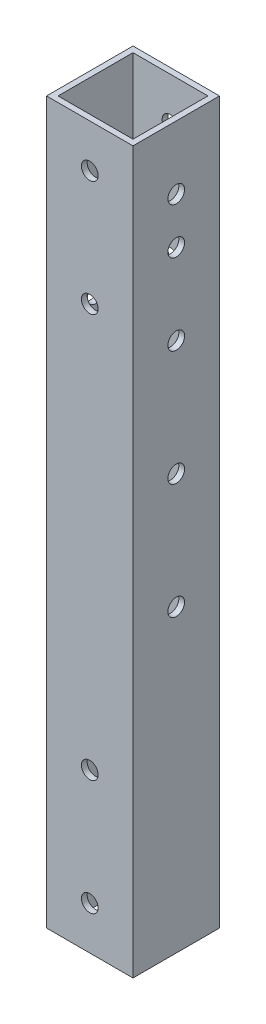
ISO-10303-21;
HEADER;
FILE_DESCRIPTION(('STEP AP214'),'2;1');
FILE_NAME('part.step','',(''),(''),'','','');
FILE_SCHEMA(('AUTOMOTIVE_DESIGN { 1 0 10303 214 1 1 1 1 }'));
ENDSEC;
DATA;
#1=APPLICATION_CONTEXT('core data for automotive mechanical design processes');
#2=APPLICATION_PROTOCOL_DEFINITION('international standard','automotive_design',2000,#1);
#3=PRODUCT_CONTEXT('',#1,'mechanical');
#4=PRODUCT('Part','Part','',(#3));
#5=PRODUCT_RELATED_PRODUCT_CATEGORY('part','',(#4));
#6=PRODUCT_DEFINITION_FORMATION('','',#4);
#7=PRODUCT_DEFINITION_CONTEXT('part definition',#1,'design');
#8=PRODUCT_DEFINITION('design','',#6,#7);
#9=PRODUCT_DEFINITION_SHAPE('','',#8);
#10=(LENGTH_UNIT() NAMED_UNIT(*) SI_UNIT(.MILLI.,.METRE.));
#11=(NAMED_UNIT(*) PLANE_ANGLE_UNIT() SI_UNIT($,.RADIAN.));
#12=(NAMED_UNIT(*) SI_UNIT($,.STERADIAN.) SOLID_ANGLE_UNIT());
#13=UNCERTAINTY_MEASURE_WITH_UNIT(LENGTH_MEASURE(1.E-05),#10,'distance_accuracy_value','');
#14=(GEOMETRIC_REPRESENTATION_CONTEXT(3) GLOBAL_UNCERTAINTY_ASSIGNED_CONTEXT((#13)) GLOBAL_UNIT_ASSIGNED_CONTEXT((#10,
#11,#12)) REPRESENTATION_CONTEXT('',''));
#15=CARTESIAN_POINT('',(0.,0.,0.));
#16=DIRECTION('',(0.,0.,1.));
#17=DIRECTION('',(1.,0.,0.));
#18=AXIS2_PLACEMENT_3D('',#15,#16,#17);
#19=CARTESIAN_POINT('',(0.,125.,0.));
#20=DIRECTION('',(0.,1.,0.));
#21=DIRECTION('',(0.,0.,1.));
#22=AXIS2_PLACEMENT_3D('',#19,#20,#21);
#23=PLANE('',#22);
#24=DIRECTION('',(0.,0.,-1.));
#25=VECTOR('',#24,1.);
#26=CARTESIAN_POINT('',(7.5,125.,7.5));
#27=LINE('',#26,#25);
#28=CARTESIAN_POINT('',(7.5,125.,7.5));
#29=VERTEX_POINT('',#28);
#30=CARTESIAN_POINT('',(7.5,125.,-7.5));
#31=VERTEX_POINT('',#30);
#32=EDGE_CURVE('E187',#29,#31,#27,.T.);
#33=ORIENTED_EDGE('',*,*,#32,.T.);
#34=DIRECTION('',(-1.,0.,0.));
#35=VECTOR('',#34,1.);
#36=CARTESIAN_POINT('',(-7.5,125.,-7.5));
#37=LINE('',#36,#35);
#38=CARTESIAN_POINT('',(-7.5,125.,-7.5));
#39=VERTEX_POINT('',#38);
#40=EDGE_CURVE('E191',#31,#39,#37,.T.);
#41=ORIENTED_EDGE('',*,*,#40,.T.);
#42=DIRECTION('',(0.,0.,1.));
#43=VECTOR('',#42,1.);
#44=CARTESIAN_POINT('',(-7.5,125.,7.5));
#45=LINE('',#44,#43);
#46=CARTESIAN_POINT('',(-7.5,125.,7.5));
#47=VERTEX_POINT('',#46);
#48=EDGE_CURVE('E195',#39,#47,#45,.T.);
#49=ORIENTED_EDGE('',*,*,#48,.T.);
#50=DIRECTION('',(1.,0.,0.));
#51=VECTOR('',#50,1.);
#52=CARTESIAN_POINT('',(-7.5,125.,7.5));
#53=LINE('',#52,#51);
#54=EDGE_CURVE('E198',#47,#29,#53,.T.);
#55=ORIENTED_EDGE('',*,*,#54,.T.);
#56=EDGE_LOOP('',(#33,#41,#49,#55));
#57=FACE_BOUND('',#56,.T.);
#58=DIRECTION('',(-1.,0.,0.));
#59=VECTOR('',#58,1.);
#60=CARTESIAN_POINT('',(0.,125.,-6.5));
#61=LINE('',#60,#59);
#62=CARTESIAN_POINT('',(6.5,125.,-6.5));
#63=VERTEX_POINT('',#62);
#64=CARTESIAN_POINT('',(-6.5,125.,-6.5));
#65=VERTEX_POINT('',#64);
#66=EDGE_CURVE('E146',#63,#65,#61,.T.);
#67=ORIENTED_EDGE('',*,*,#66,.F.);
#68=DIRECTION('',(0.,0.,-1.));
#69=VECTOR('',#68,1.);
#70=CARTESIAN_POINT('',(6.5,125.,0.));
#71=LINE('',#70,#69);
#72=CARTESIAN_POINT('',(6.5,125.,6.5));
#73=VERTEX_POINT('',#72);
#74=EDGE_CURVE('E137',#73,#63,#71,.T.);
#75=ORIENTED_EDGE('',*,*,#74,.F.);
#76=DIRECTION('',(1.,0.,0.));
#77=VECTOR('',#76,1.);
#78=CARTESIAN_POINT('',(0.,125.,6.5));
#79=LINE('',#78,#77);
#80=CARTESIAN_POINT('',(-6.5,125.,6.5));
#81=VERTEX_POINT('',#80);
#82=EDGE_CURVE('E163',#81,#73,#79,.T.);
#83=ORIENTED_EDGE('',*,*,#82,.F.);
#84=DIRECTION('',(0.,0.,1.));
#85=VECTOR('',#84,1.);
#86=CARTESIAN_POINT('',(-6.5,125.,0.));
#87=LINE('',#86,#85);
#88=EDGE_CURVE('E159',#65,#81,#87,.T.);
#89=ORIENTED_EDGE('',*,*,#88,.F.);
#90=EDGE_LOOP('',(#67,#75,#83,#89));
#91=FACE_BOUND('',#90,.T.);
#92=ADVANCED_FACE('F69',(#57,#91),#23,.T.);
#93=CARTESIAN_POINT('',(0.,0.,0.));
#94=DIRECTION('',(0.,1.,0.));
#95=DIRECTION('',(0.,0.,1.));
#96=AXIS2_PLACEMENT_3D('',#93,#94,#95);
#97=PLANE('',#96);
#98=DIRECTION('',(0.,0.,-1.));
#99=VECTOR('',#98,1.);
#100=CARTESIAN_POINT('',(7.5,0.,7.5));
#101=LINE('',#100,#99);
#102=CARTESIAN_POINT('',(7.5,0.,7.5));
#103=VERTEX_POINT('',#102);
#104=CARTESIAN_POINT('',(7.5,0.,-7.5));
#105=VERTEX_POINT('',#104);
#106=EDGE_CURVE('E155',#103,#105,#101,.T.);
#107=ORIENTED_EDGE('',*,*,#106,.F.);
#108=DIRECTION('',(1.,0.,0.));
#109=VECTOR('',#108,1.);
#110=CARTESIAN_POINT('',(-7.5,0.,7.5));
#111=LINE('',#110,#109);
#112=CARTESIAN_POINT('',(-7.5,0.,7.5));
#113=VERTEX_POINT('',#112);
#114=EDGE_CURVE('E192',#113,#103,#111,.T.);
#115=ORIENTED_EDGE('',*,*,#114,.F.);
#116=DIRECTION('',(0.,0.,1.));
#117=VECTOR('',#116,1.);
#118=CARTESIAN_POINT('',(-7.5,0.,7.5));
#119=LINE('',#118,#117);
#120=CARTESIAN_POINT('',(-7.5,0.,-7.5));
#121=VERTEX_POINT('',#120);
#122=EDGE_CURVE('E208',#121,#113,#119,.T.);
#123=ORIENTED_EDGE('',*,*,#122,.F.);
#124=DIRECTION('',(-1.,0.,0.));
#125=VECTOR('',#124,1.);
#126=CARTESIAN_POINT('',(-7.5,0.,-7.5));
#127=LINE('',#126,#125);
#128=EDGE_CURVE('E205',#105,#121,#127,.T.);
#129=ORIENTED_EDGE('',*,*,#128,.F.);
#130=EDGE_LOOP('',(#107,#115,#123,#129));
#131=FACE_BOUND('',#130,.T.);
#132=DIRECTION('',(0.,0.,-1.));
#133=VECTOR('',#132,1.);
#134=CARTESIAN_POINT('',(6.5,0.,0.));
#135=LINE('',#134,#133);
#136=CARTESIAN_POINT('',(6.5,0.,6.5));
#137=VERTEX_POINT('',#136);
#138=CARTESIAN_POINT('',(6.5,0.,-6.5));
#139=VERTEX_POINT('',#138);
#140=EDGE_CURVE('E95',#137,#139,#135,.T.);
#141=ORIENTED_EDGE('',*,*,#140,.T.);
#142=DIRECTION('',(-1.,0.,0.));
#143=VECTOR('',#142,1.);
#144=CARTESIAN_POINT('',(0.,0.,-6.5));
#145=LINE('',#144,#143);
#146=CARTESIAN_POINT('',(-6.5,0.,-6.5));
#147=VERTEX_POINT('',#146);
#148=EDGE_CURVE('E153',#139,#147,#145,.T.);
#149=ORIENTED_EDGE('',*,*,#148,.T.);
#150=DIRECTION('',(0.,0.,1.));
#151=VECTOR('',#150,1.);
#152=CARTESIAN_POINT('',(-6.5,0.,0.));
#153=LINE('',#152,#151);
#154=CARTESIAN_POINT('',(-6.5,0.,6.5));
#155=VERTEX_POINT('',#154);
#156=EDGE_CURVE('E174',#147,#155,#153,.T.);
#157=ORIENTED_EDGE('',*,*,#156,.T.);
#158=DIRECTION('',(1.,0.,0.));
#159=VECTOR('',#158,1.);
#160=CARTESIAN_POINT('',(0.,0.,6.5));
#161=LINE('',#160,#159);
#162=EDGE_CURVE('E147',#155,#137,#161,.T.);
#163=ORIENTED_EDGE('',*,*,#162,.T.);
#164=EDGE_LOOP('',(#141,#149,#157,#163));
#165=FACE_BOUND('',#164,.T.);
#166=ADVANCED_FACE('F358',(#131,#165),#97,.F.);
#167=CARTESIAN_POINT('',(7.5,125.,7.5));
#168=DIRECTION('',(-1.,0.,0.));
#169=DIRECTION('',(0.,0.,1.));
#170=AXIS2_PLACEMENT_3D('',#167,#168,#169);
#171=PLANE('',#170);
#172=CARTESIAN_POINT('',(7.5,106.,0.));
#173=DIRECTION('',(1.,0.,0.));
#174=DIRECTION('',(0.,0.,-1.));
#175=AXIS2_PLACEMENT_3D('',#172,#173,#174);
#176=CIRCLE('',#175,1.45);
#177=CARTESIAN_POINT('',(7.5,106.,-1.45));
#178=VERTEX_POINT('',#177);
#179=EDGE_CURVE('E457',#178,#178,#176,.T.);
#180=ORIENTED_EDGE('',*,*,#179,.F.);
#181=EDGE_LOOP('',(#180));
#182=FACE_BOUND('',#181,.T.);
#183=CARTESIAN_POINT('',(7.5,114.,0.));
#184=DIRECTION('',(1.,0.,0.));
#185=DIRECTION('',(0.,0.,-1.));
#186=AXIS2_PLACEMENT_3D('',#183,#184,#185);
#187=CIRCLE('',#186,1.45);
#188=CARTESIAN_POINT('',(7.5,114.,-1.45));
#189=VERTEX_POINT('',#188);
#190=EDGE_CURVE('E452',#189,#189,#187,.T.);
#191=ORIENTED_EDGE('',*,*,#190,.F.);
#192=EDGE_LOOP('',(#191));
#193=FACE_BOUND('',#192,.T.);
#194=CARTESIAN_POINT('',(7.5,52.,0.));
#195=DIRECTION('',(1.,0.,0.));
#196=DIRECTION('',(0.,0.,-1.));
#197=AXIS2_PLACEMENT_3D('',#194,#195,#196);
#198=CIRCLE('',#197,1.45);
#199=CARTESIAN_POINT('',(7.5,52.,-1.45));
#200=VERTEX_POINT('',#199);
#201=EDGE_CURVE('E444',#200,#200,#198,.T.);
#202=ORIENTED_EDGE('',*,*,#201,.F.);
#203=EDGE_LOOP('',(#202));
#204=FACE_BOUND('',#203,.T.);
#205=CARTESIAN_POINT('',(7.5,92.,0.));
#206=DIRECTION('',(1.,0.,0.));
#207=DIRECTION('',(0.,0.,-1.));
#208=AXIS2_PLACEMENT_3D('',#205,#206,#207);
#209=CIRCLE('',#208,1.45);
#210=CARTESIAN_POINT('',(7.5,92.,-1.45));
#211=VERTEX_POINT('',#210);
#212=EDGE_CURVE('E408',#211,#211,#209,.T.);
#213=ORIENTED_EDGE('',*,*,#212,.F.);
#214=EDGE_LOOP('',(#213));
#215=FACE_BOUND('',#214,.T.);
#216=CARTESIAN_POINT('',(7.5,72.,0.));
#217=DIRECTION('',(1.,0.,0.));
#218=DIRECTION('',(0.,0.,-1.));
#219=AXIS2_PLACEMENT_3D('',#216,#217,#218);
#220=CIRCLE('',#219,1.45);
#221=CARTESIAN_POINT('',(7.5,72.,-1.45));
#222=VERTEX_POINT('',#221);
#223=EDGE_CURVE('E404',#222,#222,#220,.T.);
#224=ORIENTED_EDGE('',*,*,#223,.F.);
#225=EDGE_LOOP('',(#224));
#226=FACE_BOUND('',#225,.T.);
#227=ORIENTED_EDGE('',*,*,#106,.T.);
#228=DIRECTION('',(0.,-1.,0.));
#229=VECTOR('',#228,1.);
#230=CARTESIAN_POINT('',(7.5,125.,-7.5));
#231=LINE('',#230,#229);
#232=EDGE_CURVE('E12',#31,#105,#231,.T.);
#233=ORIENTED_EDGE('',*,*,#232,.F.);
#234=ORIENTED_EDGE('',*,*,#32,.F.);
#235=DIRECTION('',(0.,-1.,0.));
#236=VECTOR('',#235,1.);
#237=CARTESIAN_POINT('',(7.5,125.,7.5));
#238=LINE('',#237,#236);
#239=EDGE_CURVE('E201',#29,#103,#238,.T.);
#240=ORIENTED_EDGE('',*,*,#239,.T.);
#241=EDGE_LOOP('',(#227,#233,#234,#240));
#242=FACE_BOUND('',#241,.T.);
#243=ADVANCED_FACE('F71',(#182,#193,#204,#215,#226,#242),#171,.F.);
#244=CARTESIAN_POINT('',(-7.5,125.,-7.5));
#245=DIRECTION('',(0.,0.,1.));
#246=DIRECTION('',(1.,0.,0.));
#247=AXIS2_PLACEMENT_3D('',#244,#245,#246);
#248=PLANE('',#247);
#249=CARTESIAN_POINT('',(0.,7.5,-7.5));
#250=DIRECTION('',(0.,0.,1.));
#251=DIRECTION('',(1.,0.,0.));
#252=AXIS2_PLACEMENT_3D('',#249,#250,#251);
#253=CIRCLE('',#252,1.45);
#254=CARTESIAN_POINT('',(1.45,7.5,-7.5));
#255=VERTEX_POINT('',#254);
#256=EDGE_CURVE('E228',#255,#255,#253,.T.);
#257=ORIENTED_EDGE('',*,*,#256,.T.);
#258=EDGE_LOOP('',(#257));
#259=FACE_BOUND('',#258,.T.);
#260=CARTESIAN_POINT('',(0.,27.5,-7.5));
#261=DIRECTION('',(0.,0.,1.));
#262=DIRECTION('',(1.,0.,0.));
#263=AXIS2_PLACEMENT_3D('',#260,#261,#262);
#264=CIRCLE('',#263,1.45);
#265=CARTESIAN_POINT('',(1.45,27.5,-7.5));
#266=VERTEX_POINT('',#265);
#267=EDGE_CURVE('E291',#266,#266,#264,.T.);
#268=ORIENTED_EDGE('',*,*,#267,.T.);
#269=EDGE_LOOP('',(#268));
#270=FACE_BOUND('',#269,.T.);
#271=CARTESIAN_POINT('',(0.,97.5,-7.5));
#272=DIRECTION('',(0.,0.,1.));
#273=DIRECTION('',(-1.,0.,0.));
#274=AXIS2_PLACEMENT_3D('',#271,#272,#273);
#275=CIRCLE('',#274,1.45);
#276=CARTESIAN_POINT('',(-1.45,97.5,-7.5));
#277=VERTEX_POINT('',#276);
#278=EDGE_CURVE('E299',#277,#277,#275,.T.);
#279=ORIENTED_EDGE('',*,*,#278,.T.);
#280=EDGE_LOOP('',(#279));
#281=FACE_BOUND('',#280,.T.);
#282=CARTESIAN_POINT('',(0.,117.5,-7.5));
#283=DIRECTION('',(0.,0.,1.));
#284=DIRECTION('',(-1.,0.,0.));
#285=AXIS2_PLACEMENT_3D('',#282,#283,#284);
#286=CIRCLE('',#285,1.45);
#287=CARTESIAN_POINT('',(-1.45,117.5,-7.5));
#288=VERTEX_POINT('',#287);
#289=EDGE_CURVE('E279',#288,#288,#286,.T.);
#290=ORIENTED_EDGE('',*,*,#289,.T.);
#291=EDGE_LOOP('',(#290));
#292=FACE_BOUND('',#291,.T.);
#293=ORIENTED_EDGE('',*,*,#128,.T.);
#294=DIRECTION('',(0.,-1.,0.));
#295=VECTOR('',#294,1.);
#296=CARTESIAN_POINT('',(-7.5,125.,-7.5));
#297=LINE('',#296,#295);
#298=EDGE_CURVE('E79',#39,#121,#297,.T.);
#299=ORIENTED_EDGE('',*,*,#298,.F.);
#300=ORIENTED_EDGE('',*,*,#40,.F.);
#301=ORIENTED_EDGE('',*,*,#232,.T.);
#302=EDGE_LOOP('',(#293,#299,#300,#301));
#303=FACE_BOUND('',#302,.T.);
#304=ADVANCED_FACE('F344',(#259,#270,#281,#292,#303),#248,.F.);
#305=CARTESIAN_POINT('',(-7.5,125.,7.5));
#306=DIRECTION('',(1.,0.,0.));
#307=DIRECTION('',(0.,0.,-1.));
#308=AXIS2_PLACEMENT_3D('',#305,#306,#307);
#309=PLANE('',#308);
#310=CARTESIAN_POINT('',(-7.5,106.,0.));
#311=DIRECTION('',(1.,0.,0.));
#312=DIRECTION('',(0.,0.,-1.));
#313=AXIS2_PLACEMENT_3D('',#310,#311,#312);
#314=CIRCLE('',#313,1.45);
#315=CARTESIAN_POINT('',(-7.5,106.,-1.45));
#316=VERTEX_POINT('',#315);
#317=EDGE_CURVE('E387',#316,#316,#314,.T.);
#318=ORIENTED_EDGE('',*,*,#317,.T.);
#319=EDGE_LOOP('',(#318));
#320=FACE_BOUND('',#319,.T.);
#321=CARTESIAN_POINT('',(-7.5,114.,0.));
#322=DIRECTION('',(1.,0.,0.));
#323=DIRECTION('',(0.,0.,-1.));
#324=AXIS2_PLACEMENT_3D('',#321,#322,#323);
#325=CIRCLE('',#324,1.45);
#326=CARTESIAN_POINT('',(-7.5,114.,-1.45));
#327=VERTEX_POINT('',#326);
#328=EDGE_CURVE('E391',#327,#327,#325,.T.);
#329=ORIENTED_EDGE('',*,*,#328,.T.);
#330=EDGE_LOOP('',(#329));
#331=FACE_BOUND('',#330,.T.);
#332=CARTESIAN_POINT('',(-7.5,52.,0.));
#333=DIRECTION('',(1.,0.,0.));
#334=DIRECTION('',(0.,0.,-1.));
#335=AXIS2_PLACEMENT_3D('',#332,#333,#334);
#336=CIRCLE('',#335,1.45);
#337=CARTESIAN_POINT('',(-7.5,52.,-1.45));
#338=VERTEX_POINT('',#337);
#339=EDGE_CURVE('E395',#338,#338,#336,.T.);
#340=ORIENTED_EDGE('',*,*,#339,.T.);
#341=EDGE_LOOP('',(#340));
#342=FACE_BOUND('',#341,.T.);
#343=CARTESIAN_POINT('',(-7.5,92.,0.));
#344=DIRECTION('',(1.,0.,0.));
#345=DIRECTION('',(0.,0.,-1.));
#346=AXIS2_PLACEMENT_3D('',#343,#344,#345);
#347=CIRCLE('',#346,1.45);
#348=CARTESIAN_POINT('',(-7.5,92.,-1.45));
#349=VERTEX_POINT('',#348);
#350=EDGE_CURVE('E399',#349,#349,#347,.T.);
#351=ORIENTED_EDGE('',*,*,#350,.T.);
#352=EDGE_LOOP('',(#351));
#353=FACE_BOUND('',#352,.T.);
#354=CARTESIAN_POINT('',(-7.5,72.,0.));
#355=DIRECTION('',(1.,0.,0.));
#356=DIRECTION('',(0.,0.,-1.));
#357=AXIS2_PLACEMENT_3D('',#354,#355,#356);
#358=CIRCLE('',#357,1.45);
#359=CARTESIAN_POINT('',(-7.5,72.,-1.45));
#360=VERTEX_POINT('',#359);
#361=EDGE_CURVE('E248',#360,#360,#358,.T.);
#362=ORIENTED_EDGE('',*,*,#361,.T.);
#363=EDGE_LOOP('',(#362));
#364=FACE_BOUND('',#363,.T.);
#365=ORIENTED_EDGE('',*,*,#122,.T.);
#366=DIRECTION('',(0.,-1.,0.));
#367=VECTOR('',#366,1.);
#368=CARTESIAN_POINT('',(-7.5,125.,7.5));
#369=LINE('',#368,#367);
#370=EDGE_CURVE('E216',#47,#113,#369,.T.);
#371=ORIENTED_EDGE('',*,*,#370,.F.);
#372=ORIENTED_EDGE('',*,*,#48,.F.);
#373=ORIENTED_EDGE('',*,*,#298,.T.);
#374=EDGE_LOOP('',(#365,#371,#372,#373));
#375=FACE_BOUND('',#374,.T.);
#376=ADVANCED_FACE('F347',(#320,#331,#342,#353,#364,#375),#309,.F.);
#377=CARTESIAN_POINT('',(-7.5,125.,7.5));
#378=DIRECTION('',(0.,0.,-1.));
#379=DIRECTION('',(-1.,0.,0.));
#380=AXIS2_PLACEMENT_3D('',#377,#378,#379);
#381=PLANE('',#380);
#382=CARTESIAN_POINT('',(0.,7.5,7.5));
#383=DIRECTION('',(0.,0.,1.));
#384=DIRECTION('',(1.,0.,0.));
#385=AXIS2_PLACEMENT_3D('',#382,#383,#384);
#386=CIRCLE('',#385,1.45);
#387=CARTESIAN_POINT('',(1.45,7.5,7.5));
#388=VERTEX_POINT('',#387);
#389=EDGE_CURVE('E283',#388,#388,#386,.T.);
#390=ORIENTED_EDGE('',*,*,#389,.F.);
#391=EDGE_LOOP('',(#390));
#392=FACE_BOUND('',#391,.T.);
#393=CARTESIAN_POINT('',(0.,27.5,7.5));
#394=DIRECTION('',(0.,0.,1.));
#395=DIRECTION('',(1.,0.,0.));
#396=AXIS2_PLACEMENT_3D('',#393,#394,#395);
#397=CIRCLE('',#396,1.45);
#398=CARTESIAN_POINT('',(1.45,27.5,7.5));
#399=VERTEX_POINT('',#398);
#400=EDGE_CURVE('E287',#399,#399,#397,.T.);
#401=ORIENTED_EDGE('',*,*,#400,.F.);
#402=EDGE_LOOP('',(#401));
#403=FACE_BOUND('',#402,.T.);
#404=CARTESIAN_POINT('',(0.,97.5,7.5));
#405=DIRECTION('',(0.,0.,1.));
#406=DIRECTION('',(-1.,0.,0.));
#407=AXIS2_PLACEMENT_3D('',#404,#405,#406);
#408=CIRCLE('',#407,1.45);
#409=CARTESIAN_POINT('',(-1.45,97.5,7.5));
#410=VERTEX_POINT('',#409);
#411=EDGE_CURVE('E295',#410,#410,#408,.T.);
#412=ORIENTED_EDGE('',*,*,#411,.F.);
#413=EDGE_LOOP('',(#412));
#414=FACE_BOUND('',#413,.T.);
#415=CARTESIAN_POINT('',(0.,117.5,7.5));
#416=DIRECTION('',(0.,0.,1.));
#417=DIRECTION('',(-1.,0.,0.));
#418=AXIS2_PLACEMENT_3D('',#415,#416,#417);
#419=CIRCLE('',#418,1.45);
#420=CARTESIAN_POINT('',(-1.45,117.5,7.5));
#421=VERTEX_POINT('',#420);
#422=EDGE_CURVE('E303',#421,#421,#419,.T.);
#423=ORIENTED_EDGE('',*,*,#422,.F.);
#424=EDGE_LOOP('',(#423));
#425=FACE_BOUND('',#424,.T.);
#426=ORIENTED_EDGE('',*,*,#114,.T.);
#427=ORIENTED_EDGE('',*,*,#239,.F.);
#428=ORIENTED_EDGE('',*,*,#54,.F.);
#429=ORIENTED_EDGE('',*,*,#370,.T.);
#430=EDGE_LOOP('',(#426,#427,#428,#429));
#431=FACE_BOUND('',#430,.T.);
#432=ADVANCED_FACE('F362',(#392,#403,#414,#425,#431),#381,.F.);
#433=CARTESIAN_POINT('',(6.5,125.,0.));
#434=DIRECTION('',(-1.,0.,0.));
#435=DIRECTION('',(0.,0.,1.));
#436=AXIS2_PLACEMENT_3D('',#433,#434,#435);
#437=PLANE('',#436);
#438=CARTESIAN_POINT('',(6.5,106.,0.));
#439=DIRECTION('',(-1.,0.,0.));
#440=DIRECTION('',(0.,0.,1.));
#441=AXIS2_PLACEMENT_3D('',#438,#439,#440);
#442=CIRCLE('',#441,1.45);
#443=CARTESIAN_POINT('',(6.5,106.,1.45));
#444=VERTEX_POINT('',#443);
#445=EDGE_CURVE('E275',#444,#444,#442,.T.);
#446=ORIENTED_EDGE('',*,*,#445,.F.);
#447=EDGE_LOOP('',(#446));
#448=FACE_BOUND('',#447,.T.);
#449=CARTESIAN_POINT('',(6.5,114.,0.));
#450=DIRECTION('',(-1.,0.,0.));
#451=DIRECTION('',(0.,0.,1.));
#452=AXIS2_PLACEMENT_3D('',#449,#450,#451);
#453=CIRCLE('',#452,1.45);
#454=CARTESIAN_POINT('',(6.5,114.,1.45));
#455=VERTEX_POINT('',#454);
#456=EDGE_CURVE('E261',#455,#455,#453,.T.);
#457=ORIENTED_EDGE('',*,*,#456,.F.);
#458=EDGE_LOOP('',(#457));
#459=FACE_BOUND('',#458,.T.);
#460=CARTESIAN_POINT('',(6.5,52.,0.));
#461=DIRECTION('',(-1.,0.,0.));
#462=DIRECTION('',(0.,0.,1.));
#463=AXIS2_PLACEMENT_3D('',#460,#461,#462);
#464=CIRCLE('',#463,1.45);
#465=CARTESIAN_POINT('',(6.5,52.,1.45));
#466=VERTEX_POINT('',#465);
#467=EDGE_CURVE('E257',#466,#466,#464,.T.);
#468=ORIENTED_EDGE('',*,*,#467,.F.);
#469=EDGE_LOOP('',(#468));
#470=FACE_BOUND('',#469,.T.);
#471=CARTESIAN_POINT('',(6.5,92.,0.));
#472=DIRECTION('',(-1.,0.,0.));
#473=DIRECTION('',(0.,0.,1.));
#474=AXIS2_PLACEMENT_3D('',#471,#472,#473);
#475=CIRCLE('',#474,1.45);
#476=CARTESIAN_POINT('',(6.5,92.,1.45));
#477=VERTEX_POINT('',#476);
#478=EDGE_CURVE('E253',#477,#477,#475,.T.);
#479=ORIENTED_EDGE('',*,*,#478,.F.);
#480=EDGE_LOOP('',(#479));
#481=FACE_BOUND('',#480,.T.);
#482=CARTESIAN_POINT('',(6.5,72.,0.));
#483=DIRECTION('',(-1.,0.,0.));
#484=DIRECTION('',(0.,0.,1.));
#485=AXIS2_PLACEMENT_3D('',#482,#483,#484);
#486=CIRCLE('',#485,1.45);
#487=CARTESIAN_POINT('',(6.5,72.,1.45));
#488=VERTEX_POINT('',#487);
#489=EDGE_CURVE('E247',#488,#488,#486,.T.);
#490=ORIENTED_EDGE('',*,*,#489,.F.);
#491=EDGE_LOOP('',(#490));
#492=FACE_BOUND('',#491,.T.);
#493=ORIENTED_EDGE('',*,*,#140,.F.);
#494=DIRECTION('',(0.,-1.,0.));
#495=VECTOR('',#494,1.);
#496=CARTESIAN_POINT('',(6.5,125.,6.5));
#497=LINE('',#496,#495);
#498=EDGE_CURVE('E141',#73,#137,#497,.T.);
#499=ORIENTED_EDGE('',*,*,#498,.F.);
#500=ORIENTED_EDGE('',*,*,#74,.T.);
#501=DIRECTION('',(0.,-1.,0.));
#502=VECTOR('',#501,1.);
#503=CARTESIAN_POINT('',(6.5,125.,-6.5));
#504=LINE('',#503,#502);
#505=EDGE_CURVE('E140',#63,#139,#504,.T.);
#506=ORIENTED_EDGE('',*,*,#505,.T.);
#507=EDGE_LOOP('',(#493,#499,#500,#506));
#508=FACE_BOUND('',#507,.T.);
#509=ADVANCED_FACE('F139',(#448,#459,#470,#481,#492,#508),#437,.T.);
#510=CARTESIAN_POINT('',(0.,125.,-6.5));
#511=DIRECTION('',(0.,0.,1.));
#512=DIRECTION('',(1.,0.,0.));
#513=AXIS2_PLACEMENT_3D('',#510,#511,#512);
#514=PLANE('',#513);
#515=CARTESIAN_POINT('',(0.,7.5,-6.5));
#516=DIRECTION('',(0.,0.,1.));
#517=DIRECTION('',(1.,0.,0.));
#518=AXIS2_PLACEMENT_3D('',#515,#516,#517);
#519=CIRCLE('',#518,1.45);
#520=CARTESIAN_POINT('',(1.45,7.5,-6.5));
#521=VERTEX_POINT('',#520);
#522=EDGE_CURVE('E171',#521,#521,#519,.T.);
#523=ORIENTED_EDGE('',*,*,#522,.F.);
#524=EDGE_LOOP('',(#523));
#525=FACE_BOUND('',#524,.T.);
#526=CARTESIAN_POINT('',(0.,27.5,-6.5));
#527=DIRECTION('',(0.,0.,1.));
#528=DIRECTION('',(1.,0.,0.));
#529=AXIS2_PLACEMENT_3D('',#526,#527,#528);
#530=CIRCLE('',#529,1.45);
#531=CARTESIAN_POINT('',(1.45,27.5,-6.5));
#532=VERTEX_POINT('',#531);
#533=EDGE_CURVE('E238',#532,#532,#530,.T.);
#534=ORIENTED_EDGE('',*,*,#533,.F.);
#535=EDGE_LOOP('',(#534));
#536=FACE_BOUND('',#535,.T.);
#537=CARTESIAN_POINT('',(0.,97.5,-6.5));
#538=DIRECTION('',(0.,0.,1.));
#539=DIRECTION('',(1.,0.,0.));
#540=AXIS2_PLACEMENT_3D('',#537,#538,#539);
#541=CIRCLE('',#540,1.45);
#542=CARTESIAN_POINT('',(1.45,97.5,-6.5));
#543=VERTEX_POINT('',#542);
#544=EDGE_CURVE('E233',#543,#543,#541,.T.);
#545=ORIENTED_EDGE('',*,*,#544,.F.);
#546=EDGE_LOOP('',(#545));
#547=FACE_BOUND('',#546,.T.);
#548=CARTESIAN_POINT('',(0.,117.5,-6.5));
#549=DIRECTION('',(0.,0.,1.));
#550=DIRECTION('',(1.,0.,0.));
#551=AXIS2_PLACEMENT_3D('',#548,#549,#550);
#552=CIRCLE('',#551,1.45);
#553=CARTESIAN_POINT('',(1.45,117.5,-6.5));
#554=VERTEX_POINT('',#553);
#555=EDGE_CURVE('E227',#554,#554,#552,.T.);
#556=ORIENTED_EDGE('',*,*,#555,.F.);
#557=EDGE_LOOP('',(#556));
#558=FACE_BOUND('',#557,.T.);
#559=ORIENTED_EDGE('',*,*,#148,.F.);
#560=ORIENTED_EDGE('',*,*,#505,.F.);
#561=ORIENTED_EDGE('',*,*,#66,.T.);
#562=DIRECTION('',(0.,-1.,0.));
#563=VECTOR('',#562,1.);
#564=CARTESIAN_POINT('',(-6.5,125.,-6.5));
#565=LINE('',#564,#563);
#566=EDGE_CURVE('E156',#65,#147,#565,.T.);
#567=ORIENTED_EDGE('',*,*,#566,.T.);
#568=EDGE_LOOP('',(#559,#560,#561,#567));
#569=FACE_BOUND('',#568,.T.);
#570=ADVANCED_FACE('F150',(#525,#536,#547,#558,#569),#514,.T.);
#571=CARTESIAN_POINT('',(-6.5,125.,0.));
#572=DIRECTION('',(1.,0.,0.));
#573=DIRECTION('',(0.,0.,-1.));
#574=AXIS2_PLACEMENT_3D('',#571,#572,#573);
#575=PLANE('',#574);
#576=CARTESIAN_POINT('',(-6.5,106.,0.));
#577=DIRECTION('',(1.,0.,0.));
#578=DIRECTION('',(0.,0.,-1.));
#579=AXIS2_PLACEMENT_3D('',#576,#577,#578);
#580=CIRCLE('',#579,1.45);
#581=CARTESIAN_POINT('',(-6.5,106.,-1.45));
#582=VERTEX_POINT('',#581);
#583=EDGE_CURVE('E73',#582,#582,#580,.T.);
#584=ORIENTED_EDGE('',*,*,#583,.F.);
#585=EDGE_LOOP('',(#584));
#586=FACE_BOUND('',#585,.T.);
#587=CARTESIAN_POINT('',(-6.5,114.,0.));
#588=DIRECTION('',(1.,0.,0.));
#589=DIRECTION('',(0.,0.,-1.));
#590=AXIS2_PLACEMENT_3D('',#587,#588,#589);
#591=CIRCLE('',#590,1.45);
#592=CARTESIAN_POINT('',(-6.5,114.,-1.45));
#593=VERTEX_POINT('',#592);
#594=EDGE_CURVE('E258',#593,#593,#591,.T.);
#595=ORIENTED_EDGE('',*,*,#594,.F.);
#596=EDGE_LOOP('',(#595));
#597=FACE_BOUND('',#596,.T.);
#598=CARTESIAN_POINT('',(-6.5,52.,0.));
#599=DIRECTION('',(1.,0.,0.));
#600=DIRECTION('',(0.,0.,-1.));
#601=AXIS2_PLACEMENT_3D('',#598,#599,#600);
#602=CIRCLE('',#601,1.45);
#603=CARTESIAN_POINT('',(-6.5,52.,-1.45));
#604=VERTEX_POINT('',#603);
#605=EDGE_CURVE('E254',#604,#604,#602,.T.);
#606=ORIENTED_EDGE('',*,*,#605,.F.);
#607=EDGE_LOOP('',(#606));
#608=FACE_BOUND('',#607,.T.);
#609=CARTESIAN_POINT('',(-6.5,92.,0.));
#610=DIRECTION('',(1.,0.,0.));
#611=DIRECTION('',(0.,0.,-1.));
#612=AXIS2_PLACEMENT_3D('',#609,#610,#611);
#613=CIRCLE('',#612,1.45);
#614=CARTESIAN_POINT('',(-6.5,92.,-1.45));
#615=VERTEX_POINT('',#614);
#616=EDGE_CURVE('E249',#615,#615,#613,.T.);
#617=ORIENTED_EDGE('',*,*,#616,.F.);
#618=EDGE_LOOP('',(#617));
#619=FACE_BOUND('',#618,.T.);
#620=CARTESIAN_POINT('',(-6.5,72.,0.));
#621=DIRECTION('',(1.,0.,0.));
#622=DIRECTION('',(0.,0.,-1.));
#623=AXIS2_PLACEMENT_3D('',#620,#621,#622);
#624=CIRCLE('',#623,1.45);
#625=CARTESIAN_POINT('',(-6.5,72.,-1.45));
#626=VERTEX_POINT('',#625);
#627=EDGE_CURVE('E243',#626,#626,#624,.T.);
#628=ORIENTED_EDGE('',*,*,#627,.F.);
#629=EDGE_LOOP('',(#628));
#630=FACE_BOUND('',#629,.T.);
#631=ORIENTED_EDGE('',*,*,#156,.F.);
#632=ORIENTED_EDGE('',*,*,#566,.F.);
#633=ORIENTED_EDGE('',*,*,#88,.T.);
#634=DIRECTION('',(0.,-1.,0.));
#635=VECTOR('',#634,1.);
#636=CARTESIAN_POINT('',(-6.5,125.,6.5));
#637=LINE('',#636,#635);
#638=EDGE_CURVE('E87',#81,#155,#637,.T.);
#639=ORIENTED_EDGE('',*,*,#638,.T.);
#640=EDGE_LOOP('',(#631,#632,#633,#639));
#641=FACE_BOUND('',#640,.T.);
#642=ADVANCED_FACE('F327',(#586,#597,#608,#619,#630,#641),#575,.T.);
#643=CARTESIAN_POINT('',(0.,125.,6.5));
#644=DIRECTION('',(0.,0.,-1.));
#645=DIRECTION('',(-1.,0.,0.));
#646=AXIS2_PLACEMENT_3D('',#643,#644,#645);
#647=PLANE('',#646);
#648=CARTESIAN_POINT('',(0.,7.5,6.5));
#649=DIRECTION('',(0.,0.,-1.));
#650=DIRECTION('',(-1.,0.,0.));
#651=AXIS2_PLACEMENT_3D('',#648,#649,#650);
#652=CIRCLE('',#651,1.45);
#653=CARTESIAN_POINT('',(-1.45,7.5,6.5));
#654=VERTEX_POINT('',#653);
#655=EDGE_CURVE('E239',#654,#654,#652,.T.);
#656=ORIENTED_EDGE('',*,*,#655,.F.);
#657=EDGE_LOOP('',(#656));
#658=FACE_BOUND('',#657,.T.);
#659=CARTESIAN_POINT('',(0.,27.5,6.5));
#660=DIRECTION('',(0.,0.,-1.));
#661=DIRECTION('',(-1.,0.,0.));
#662=AXIS2_PLACEMENT_3D('',#659,#660,#661);
#663=CIRCLE('',#662,1.45);
#664=CARTESIAN_POINT('',(-1.45,27.5,6.5));
#665=VERTEX_POINT('',#664);
#666=EDGE_CURVE('E234',#665,#665,#663,.T.);
#667=ORIENTED_EDGE('',*,*,#666,.F.);
#668=EDGE_LOOP('',(#667));
#669=FACE_BOUND('',#668,.T.);
#670=CARTESIAN_POINT('',(0.,97.5,6.5));
#671=DIRECTION('',(0.,0.,-1.));
#672=DIRECTION('',(-1.,0.,0.));
#673=AXIS2_PLACEMENT_3D('',#670,#671,#672);
#674=CIRCLE('',#673,1.45);
#675=CARTESIAN_POINT('',(-1.45,97.5,6.5));
#676=VERTEX_POINT('',#675);
#677=EDGE_CURVE('E229',#676,#676,#674,.T.);
#678=ORIENTED_EDGE('',*,*,#677,.F.);
#679=EDGE_LOOP('',(#678));
#680=FACE_BOUND('',#679,.T.);
#681=CARTESIAN_POINT('',(0.,117.5,6.5));
#682=DIRECTION('',(0.,0.,-1.));
#683=DIRECTION('',(-1.,0.,0.));
#684=AXIS2_PLACEMENT_3D('',#681,#682,#683);
#685=CIRCLE('',#684,1.45);
#686=CARTESIAN_POINT('',(-1.45,117.5,6.5));
#687=VERTEX_POINT('',#686);
#688=EDGE_CURVE('E223',#687,#687,#685,.T.);
#689=ORIENTED_EDGE('',*,*,#688,.F.);
#690=EDGE_LOOP('',(#689));
#691=FACE_BOUND('',#690,.T.);
#692=ORIENTED_EDGE('',*,*,#162,.F.);
#693=ORIENTED_EDGE('',*,*,#638,.F.);
#694=ORIENTED_EDGE('',*,*,#82,.T.);
#695=ORIENTED_EDGE('',*,*,#498,.T.);
#696=EDGE_LOOP('',(#692,#693,#694,#695));
#697=FACE_BOUND('',#696,.T.);
#698=ADVANCED_FACE('F494',(#658,#669,#680,#691,#697),#647,.T.);
#699=CARTESIAN_POINT('',(0.,117.5,-7.5));
#700=DIRECTION('',(0.,0.,1.));
#701=DIRECTION('',(1.,0.,0.));
#702=AXIS2_PLACEMENT_3D('',#699,#700,#701);
#703=CYLINDRICAL_SURFACE('',#702,1.45);
#704=ORIENTED_EDGE('',*,*,#688,.T.);
#705=EDGE_LOOP('',(#704));
#706=FACE_BOUND('',#705,.T.);
#707=ORIENTED_EDGE('',*,*,#422,.T.);
#708=EDGE_LOOP('',(#707));
#709=FACE_BOUND('',#708,.T.);
#710=ADVANCED_FACE('F341',(#706,#709),#703,.F.);
#711=CARTESIAN_POINT('',(0.,97.5,-7.5));
#712=DIRECTION('',(0.,0.,1.));
#713=DIRECTION('',(1.,0.,0.));
#714=AXIS2_PLACEMENT_3D('',#711,#712,#713);
#715=CYLINDRICAL_SURFACE('',#714,1.45);
#716=ORIENTED_EDGE('',*,*,#677,.T.);
#717=EDGE_LOOP('',(#716));
#718=FACE_BOUND('',#717,.T.);
#719=ORIENTED_EDGE('',*,*,#411,.T.);
#720=EDGE_LOOP('',(#719));
#721=FACE_BOUND('',#720,.T.);
#722=ADVANCED_FACE('F504',(#718,#721),#715,.F.);
#723=CARTESIAN_POINT('',(0.,27.5,-7.5));
#724=DIRECTION('',(0.,0.,1.));
#725=DIRECTION('',(1.,0.,0.));
#726=AXIS2_PLACEMENT_3D('',#723,#724,#725);
#727=CYLINDRICAL_SURFACE('',#726,1.45);
#728=ORIENTED_EDGE('',*,*,#666,.T.);
#729=EDGE_LOOP('',(#728));
#730=FACE_BOUND('',#729,.T.);
#731=ORIENTED_EDGE('',*,*,#400,.T.);
#732=EDGE_LOOP('',(#731));
#733=FACE_BOUND('',#732,.T.);
#734=ADVANCED_FACE('F511',(#730,#733),#727,.F.);
#735=CARTESIAN_POINT('',(0.,7.5,-7.5));
#736=DIRECTION('',(0.,0.,1.));
#737=DIRECTION('',(1.,0.,0.));
#738=AXIS2_PLACEMENT_3D('',#735,#736,#737);
#739=CYLINDRICAL_SURFACE('',#738,1.45);
#740=ORIENTED_EDGE('',*,*,#655,.T.);
#741=EDGE_LOOP('',(#740));
#742=FACE_BOUND('',#741,.T.);
#743=ORIENTED_EDGE('',*,*,#389,.T.);
#744=EDGE_LOOP('',(#743));
#745=FACE_BOUND('',#744,.T.);
#746=ADVANCED_FACE('F339',(#742,#745),#739,.F.);
#747=ORIENTED_EDGE('',*,*,#555,.T.);
#748=EDGE_LOOP('',(#747));
#749=FACE_BOUND('',#748,.T.);
#750=ORIENTED_EDGE('',*,*,#289,.F.);
#751=EDGE_LOOP('',(#750));
#752=FACE_BOUND('',#751,.T.);
#753=ADVANCED_FACE('F335',(#749,#752),#703,.F.);
#754=ORIENTED_EDGE('',*,*,#544,.T.);
#755=EDGE_LOOP('',(#754));
#756=FACE_BOUND('',#755,.T.);
#757=ORIENTED_EDGE('',*,*,#278,.F.);
#758=EDGE_LOOP('',(#757));
#759=FACE_BOUND('',#758,.T.);
#760=ADVANCED_FACE('F338',(#756,#759),#715,.F.);
#761=ORIENTED_EDGE('',*,*,#533,.T.);
#762=EDGE_LOOP('',(#761));
#763=FACE_BOUND('',#762,.T.);
#764=ORIENTED_EDGE('',*,*,#267,.F.);
#765=EDGE_LOOP('',(#764));
#766=FACE_BOUND('',#765,.T.);
#767=ADVANCED_FACE('F490',(#763,#766),#727,.F.);
#768=ORIENTED_EDGE('',*,*,#522,.T.);
#769=EDGE_LOOP('',(#768));
#770=FACE_BOUND('',#769,.T.);
#771=ORIENTED_EDGE('',*,*,#256,.F.);
#772=EDGE_LOOP('',(#771));
#773=FACE_BOUND('',#772,.T.);
#774=ADVANCED_FACE('F322',(#770,#773),#739,.F.);
#775=CARTESIAN_POINT('',(-7.5,72.,0.));
#776=DIRECTION('',(1.,0.,0.));
#777=DIRECTION('',(0.,0.,-1.));
#778=AXIS2_PLACEMENT_3D('',#775,#776,#777);
#779=CYLINDRICAL_SURFACE('',#778,1.45);
#780=ORIENTED_EDGE('',*,*,#627,.T.);
#781=EDGE_LOOP('',(#780));
#782=FACE_BOUND('',#781,.T.);
#783=ORIENTED_EDGE('',*,*,#361,.F.);
#784=EDGE_LOOP('',(#783));
#785=FACE_BOUND('',#784,.T.);
#786=ADVANCED_FACE('F474',(#782,#785),#779,.F.);
#787=CARTESIAN_POINT('',(-7.5,92.,0.));
#788=DIRECTION('',(1.,0.,0.));
#789=DIRECTION('',(0.,0.,-1.));
#790=AXIS2_PLACEMENT_3D('',#787,#788,#789);
#791=CYLINDRICAL_SURFACE('',#790,1.45);
#792=ORIENTED_EDGE('',*,*,#616,.T.);
#793=EDGE_LOOP('',(#792));
#794=FACE_BOUND('',#793,.T.);
#795=ORIENTED_EDGE('',*,*,#350,.F.);
#796=EDGE_LOOP('',(#795));
#797=FACE_BOUND('',#796,.T.);
#798=ADVANCED_FACE('F437',(#794,#797),#791,.F.);
#799=CARTESIAN_POINT('',(-7.5,52.,0.));
#800=DIRECTION('',(1.,0.,0.));
#801=DIRECTION('',(0.,0.,-1.));
#802=AXIS2_PLACEMENT_3D('',#799,#800,#801);
#803=CYLINDRICAL_SURFACE('',#802,1.45);
#804=ORIENTED_EDGE('',*,*,#605,.T.);
#805=EDGE_LOOP('',(#804));
#806=FACE_BOUND('',#805,.T.);
#807=ORIENTED_EDGE('',*,*,#339,.F.);
#808=EDGE_LOOP('',(#807));
#809=FACE_BOUND('',#808,.T.);
#810=ADVANCED_FACE('F487',(#806,#809),#803,.F.);
#811=CARTESIAN_POINT('',(-7.5,114.,0.));
#812=DIRECTION('',(1.,0.,0.));
#813=DIRECTION('',(0.,0.,-1.));
#814=AXIS2_PLACEMENT_3D('',#811,#812,#813);
#815=CYLINDRICAL_SURFACE('',#814,1.45);
#816=ORIENTED_EDGE('',*,*,#594,.T.);
#817=EDGE_LOOP('',(#816));
#818=FACE_BOUND('',#817,.T.);
#819=ORIENTED_EDGE('',*,*,#328,.F.);
#820=EDGE_LOOP('',(#819));
#821=FACE_BOUND('',#820,.T.);
#822=ADVANCED_FACE('F478',(#818,#821),#815,.F.);
#823=CARTESIAN_POINT('',(-7.5,106.,0.));
#824=DIRECTION('',(1.,0.,0.));
#825=DIRECTION('',(0.,0.,-1.));
#826=AXIS2_PLACEMENT_3D('',#823,#824,#825);
#827=CYLINDRICAL_SURFACE('',#826,1.45);
#828=ORIENTED_EDGE('',*,*,#583,.T.);
#829=EDGE_LOOP('',(#828));
#830=FACE_BOUND('',#829,.T.);
#831=ORIENTED_EDGE('',*,*,#317,.F.);
#832=EDGE_LOOP('',(#831));
#833=FACE_BOUND('',#832,.T.);
#834=ADVANCED_FACE('F472',(#830,#833),#827,.F.);
#835=ORIENTED_EDGE('',*,*,#489,.T.);
#836=EDGE_LOOP('',(#835));
#837=FACE_BOUND('',#836,.T.);
#838=ORIENTED_EDGE('',*,*,#223,.T.);
#839=EDGE_LOOP('',(#838));
#840=FACE_BOUND('',#839,.T.);
#841=ADVANCED_FACE('F416',(#837,#840),#779,.F.);
#842=ORIENTED_EDGE('',*,*,#478,.T.);
#843=EDGE_LOOP('',(#842));
#844=FACE_BOUND('',#843,.T.);
#845=ORIENTED_EDGE('',*,*,#212,.T.);
#846=EDGE_LOOP('',(#845));
#847=FACE_BOUND('',#846,.T.);
#848=ADVANCED_FACE('F432',(#844,#847),#791,.F.);
#849=ORIENTED_EDGE('',*,*,#467,.T.);
#850=EDGE_LOOP('',(#849));
#851=FACE_BOUND('',#850,.T.);
#852=ORIENTED_EDGE('',*,*,#201,.T.);
#853=EDGE_LOOP('',(#852));
#854=FACE_BOUND('',#853,.T.);
#855=ADVANCED_FACE('F435',(#851,#854),#803,.F.);
#856=ORIENTED_EDGE('',*,*,#456,.T.);
#857=EDGE_LOOP('',(#856));
#858=FACE_BOUND('',#857,.T.);
#859=ORIENTED_EDGE('',*,*,#190,.T.);
#860=EDGE_LOOP('',(#859));
#861=FACE_BOUND('',#860,.T.);
#862=ADVANCED_FACE('F649',(#858,#861),#815,.F.);
#863=ORIENTED_EDGE('',*,*,#445,.T.);
#864=EDGE_LOOP('',(#863));
#865=FACE_BOUND('',#864,.T.);
#866=ORIENTED_EDGE('',*,*,#179,.T.);
#867=EDGE_LOOP('',(#866));
#868=FACE_BOUND('',#867,.T.);
#869=ADVANCED_FACE('F463',(#865,#868),#827,.F.);
#870=CLOSED_SHELL('',(#92,#166,#243,#304,#376,#432,#509,#570,#642,#698,#710,#722,#734,#746,#753,
#760,#767,#774,#786,#798,#810,#822,#834,#841,#848,#855,#862,#869));
#871=MANIFOLD_SOLID_BREP('B2',#870);
#872=ADVANCED_BREP_SHAPE_REPRESENTATION('',(#18,#871),#14);
#873=SHAPE_DEFINITION_REPRESENTATION(#9,#872);
ENDSEC;
END-ISO-10303-21;
